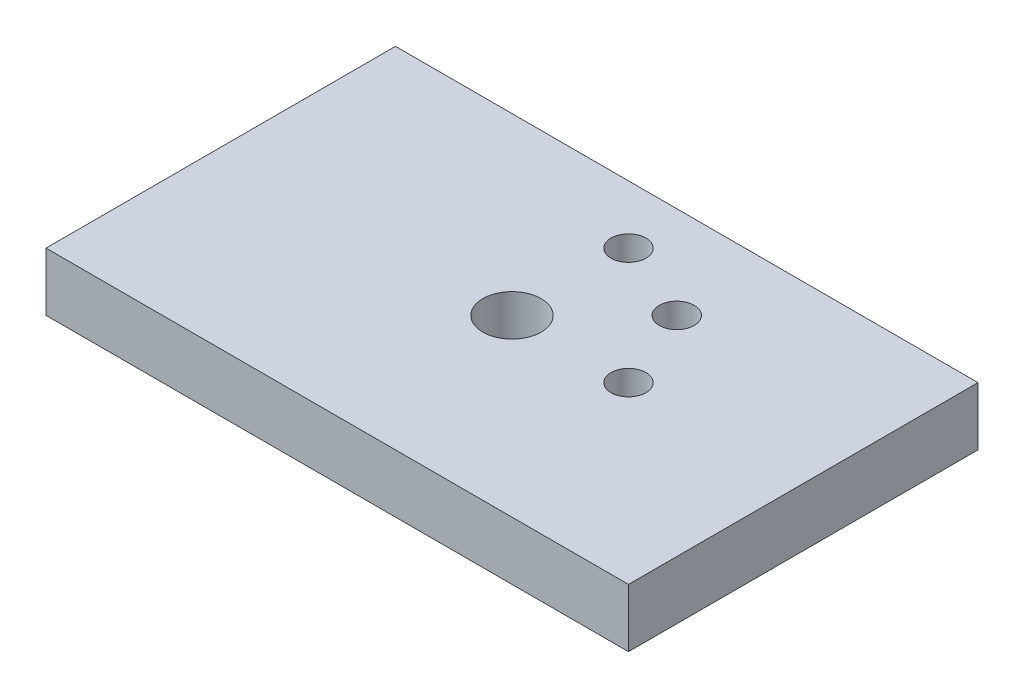
ISO-10303-21;
HEADER;
FILE_DESCRIPTION(('STEP AP214'),'2;1');
FILE_NAME('part.step','',(''),(''),'','','');
FILE_SCHEMA(('AUTOMOTIVE_DESIGN { 1 0 10303 214 1 1 1 1 }'));
ENDSEC;
DATA;
#1=APPLICATION_CONTEXT('core data for automotive mechanical design processes');
#2=APPLICATION_PROTOCOL_DEFINITION('international standard','automotive_design',2000,#1);
#3=PRODUCT_CONTEXT('',#1,'mechanical');
#4=PRODUCT('Part','Part','',(#3));
#5=PRODUCT_RELATED_PRODUCT_CATEGORY('part','',(#4));
#6=PRODUCT_DEFINITION_FORMATION('','',#4);
#7=PRODUCT_DEFINITION_CONTEXT('part definition',#1,'design');
#8=PRODUCT_DEFINITION('design','',#6,#7);
#9=PRODUCT_DEFINITION_SHAPE('','',#8);
#10=(LENGTH_UNIT() NAMED_UNIT(*) SI_UNIT(.MILLI.,.METRE.));
#11=(NAMED_UNIT(*) PLANE_ANGLE_UNIT() SI_UNIT($,.RADIAN.));
#12=(NAMED_UNIT(*) SI_UNIT($,.STERADIAN.) SOLID_ANGLE_UNIT());
#13=UNCERTAINTY_MEASURE_WITH_UNIT(LENGTH_MEASURE(1.E-05),#10,'distance_accuracy_value','');
#14=(GEOMETRIC_REPRESENTATION_CONTEXT(3) GLOBAL_UNCERTAINTY_ASSIGNED_CONTEXT((#13)) GLOBAL_UNIT_ASSIGNED_CONTEXT((#10,
#11,#12)) REPRESENTATION_CONTEXT('',''));
#15=CARTESIAN_POINT('',(0.,0.,0.));
#16=DIRECTION('',(0.,0.,1.));
#17=DIRECTION('',(1.,0.,0.));
#18=AXIS2_PLACEMENT_3D('',#15,#16,#17);
#19=CARTESIAN_POINT('',(50.,10.,30.));
#20=DIRECTION('',(-1.,0.,0.));
#21=DIRECTION('',(0.,0.,1.));
#22=AXIS2_PLACEMENT_3D('',#19,#20,#21);
#23=PLANE('',#22);
#24=DIRECTION('',(0.,0.,-1.));
#25=VECTOR('',#24,1.);
#26=CARTESIAN_POINT('',(50.,0.,30.));
#27=LINE('',#26,#25);
#28=CARTESIAN_POINT('',(50.,0.,30.));
#29=VERTEX_POINT('',#28);
#30=CARTESIAN_POINT('',(50.,0.,-30.));
#31=VERTEX_POINT('',#30);
#32=EDGE_CURVE('E102',#29,#31,#27,.T.);
#33=ORIENTED_EDGE('',*,*,#32,.T.);
#34=DIRECTION('',(0.,-1.,0.));
#35=VECTOR('',#34,1.);
#36=CARTESIAN_POINT('',(50.,10.,-30.));
#37=LINE('',#36,#35);
#38=CARTESIAN_POINT('',(50.,10.,-30.));
#39=VERTEX_POINT('',#38);
#40=EDGE_CURVE('E11',#39,#31,#37,.T.);
#41=ORIENTED_EDGE('',*,*,#40,.F.);
#42=DIRECTION('',(0.,0.,-1.));
#43=VECTOR('',#42,1.);
#44=CARTESIAN_POINT('',(50.,10.,30.));
#45=LINE('',#44,#43);
#46=CARTESIAN_POINT('',(50.,10.,30.));
#47=VERTEX_POINT('',#46);
#48=EDGE_CURVE('E90',#47,#39,#45,.T.);
#49=ORIENTED_EDGE('',*,*,#48,.F.);
#50=DIRECTION('',(0.,-1.,0.));
#51=VECTOR('',#50,1.);
#52=CARTESIAN_POINT('',(50.,10.,30.));
#53=LINE('',#52,#51);
#54=EDGE_CURVE('E98',#47,#29,#53,.T.);
#55=ORIENTED_EDGE('',*,*,#54,.T.);
#56=EDGE_LOOP('',(#33,#41,#49,#55));
#57=FACE_BOUND('',#56,.T.);
#58=ADVANCED_FACE('F39',(#57),#23,.F.);
#59=CARTESIAN_POINT('',(-50.,10.,-30.));
#60=DIRECTION('',(0.,0.,1.));
#61=DIRECTION('',(1.,0.,0.));
#62=AXIS2_PLACEMENT_3D('',#59,#60,#61);
#63=PLANE('',#62);
#64=DIRECTION('',(-1.,0.,0.));
#65=VECTOR('',#64,1.);
#66=CARTESIAN_POINT('',(-50.,0.,-30.));
#67=LINE('',#66,#65);
#68=CARTESIAN_POINT('',(-50.,0.,-30.));
#69=VERTEX_POINT('',#68);
#70=EDGE_CURVE('E94',#31,#69,#67,.T.);
#71=ORIENTED_EDGE('',*,*,#70,.T.);
#72=DIRECTION('',(0.,-1.,0.));
#73=VECTOR('',#72,1.);
#74=CARTESIAN_POINT('',(-50.,10.,-30.));
#75=LINE('',#74,#73);
#76=CARTESIAN_POINT('',(-50.,10.,-30.));
#77=VERTEX_POINT('',#76);
#78=EDGE_CURVE('E47',#77,#69,#75,.T.);
#79=ORIENTED_EDGE('',*,*,#78,.F.);
#80=DIRECTION('',(-1.,0.,0.));
#81=VECTOR('',#80,1.);
#82=CARTESIAN_POINT('',(-50.,10.,-30.));
#83=LINE('',#82,#81);
#84=EDGE_CURVE('E85',#39,#77,#83,.T.);
#85=ORIENTED_EDGE('',*,*,#84,.F.);
#86=ORIENTED_EDGE('',*,*,#40,.T.);
#87=EDGE_LOOP('',(#71,#79,#85,#86));
#88=FACE_BOUND('',#87,.T.);
#89=ADVANCED_FACE('F93',(#88),#63,.F.);
#90=CARTESIAN_POINT('',(-50.,10.,30.));
#91=DIRECTION('',(1.,0.,0.));
#92=DIRECTION('',(0.,0.,-1.));
#93=AXIS2_PLACEMENT_3D('',#90,#91,#92);
#94=PLANE('',#93);
#95=DIRECTION('',(0.,0.,1.));
#96=VECTOR('',#95,1.);
#97=CARTESIAN_POINT('',(-50.,0.,30.));
#98=LINE('',#97,#96);
#99=CARTESIAN_POINT('',(-50.,0.,30.));
#100=VERTEX_POINT('',#99);
#101=EDGE_CURVE('E72',#69,#100,#98,.T.);
#102=ORIENTED_EDGE('',*,*,#101,.T.);
#103=DIRECTION('',(0.,-1.,0.));
#104=VECTOR('',#103,1.);
#105=CARTESIAN_POINT('',(-50.,10.,30.));
#106=LINE('',#105,#104);
#107=CARTESIAN_POINT('',(-50.,10.,30.));
#108=VERTEX_POINT('',#107);
#109=EDGE_CURVE('E95',#108,#100,#106,.T.);
#110=ORIENTED_EDGE('',*,*,#109,.F.);
#111=DIRECTION('',(0.,0.,1.));
#112=VECTOR('',#111,1.);
#113=CARTESIAN_POINT('',(-50.,10.,30.));
#114=LINE('',#113,#112);
#115=EDGE_CURVE('E88',#77,#108,#114,.T.);
#116=ORIENTED_EDGE('',*,*,#115,.F.);
#117=ORIENTED_EDGE('',*,*,#78,.T.);
#118=EDGE_LOOP('',(#102,#110,#116,#117));
#119=FACE_BOUND('',#118,.T.);
#120=ADVANCED_FACE('F96',(#119),#94,.F.);
#121=CARTESIAN_POINT('',(-50.,10.,30.));
#122=DIRECTION('',(0.,0.,-1.));
#123=DIRECTION('',(-1.,0.,0.));
#124=AXIS2_PLACEMENT_3D('',#121,#122,#123);
#125=PLANE('',#124);
#126=DIRECTION('',(1.,0.,0.));
#127=VECTOR('',#126,1.);
#128=CARTESIAN_POINT('',(-50.,0.,30.));
#129=LINE('',#128,#127);
#130=EDGE_CURVE('E78',#100,#29,#129,.T.);
#131=ORIENTED_EDGE('',*,*,#130,.T.);
#132=ORIENTED_EDGE('',*,*,#54,.F.);
#133=DIRECTION('',(1.,0.,0.));
#134=VECTOR('',#133,1.);
#135=CARTESIAN_POINT('',(-50.,10.,30.));
#136=LINE('',#135,#134);
#137=EDGE_CURVE('E55',#108,#47,#136,.T.);
#138=ORIENTED_EDGE('',*,*,#137,.F.);
#139=ORIENTED_EDGE('',*,*,#109,.T.);
#140=EDGE_LOOP('',(#131,#132,#138,#139));
#141=FACE_BOUND('',#140,.T.);
#142=ADVANCED_FACE('F110',(#141),#125,.F.);
#143=CARTESIAN_POINT('',(0.,10.,0.));
#144=DIRECTION('',(0.,-1.,0.));
#145=DIRECTION('',(0.,0.,-1.));
#146=AXIS2_PLACEMENT_3D('',#143,#144,#145);
#147=PLANE('',#146);
#148=CARTESIAN_POINT('',(14.142135623731,10.,-14.142135623731));
#149=DIRECTION('',(0.,-1.,0.));
#150=DIRECTION('',(0.,0.,-1.));
#151=AXIS2_PLACEMENT_3D('',#148,#149,#150);
#152=CIRCLE('',#151,3.);
#153=CARTESIAN_POINT('',(14.142135623731,10.,-17.142135623731));
#154=VERTEX_POINT('',#153);
#155=EDGE_CURVE('E127',#154,#154,#152,.F.);
#156=ORIENTED_EDGE('',*,*,#155,.F.);
#157=EDGE_LOOP('',(#156));
#158=FACE_BOUND('',#157,.T.);
#159=CARTESIAN_POINT('',(0.,10.,-20.));
#160=DIRECTION('',(0.,-1.,0.));
#161=DIRECTION('',(0.,0.,-1.));
#162=AXIS2_PLACEMENT_3D('',#159,#160,#161);
#163=CIRCLE('',#162,3.);
#164=CARTESIAN_POINT('',(0.,10.,-23.));
#165=VERTEX_POINT('',#164);
#166=EDGE_CURVE('E130',#165,#165,#163,.F.);
#167=ORIENTED_EDGE('',*,*,#166,.F.);
#168=EDGE_LOOP('',(#167));
#169=FACE_BOUND('',#168,.T.);
#170=CARTESIAN_POINT('',(20.,10.,0.));
#171=DIRECTION('',(0.,-1.,0.));
#172=DIRECTION('',(0.,0.,-1.));
#173=AXIS2_PLACEMENT_3D('',#170,#171,#172);
#174=CIRCLE('',#173,3.);
#175=CARTESIAN_POINT('',(20.,10.,-3.));
#176=VERTEX_POINT('',#175);
#177=EDGE_CURVE('E121',#176,#176,#174,.F.);
#178=ORIENTED_EDGE('',*,*,#177,.F.);
#179=EDGE_LOOP('',(#178));
#180=FACE_BOUND('',#179,.T.);
#181=CARTESIAN_POINT('',(0.,10.,0.));
#182=DIRECTION('',(0.,-1.,0.));
#183=DIRECTION('',(0.,0.,-1.));
#184=AXIS2_PLACEMENT_3D('',#181,#182,#183);
#185=CIRCLE('',#184,5.);
#186=CARTESIAN_POINT('',(0.,10.,-5.));
#187=VERTEX_POINT('',#186);
#188=EDGE_CURVE('E105',#187,#187,#185,.F.);
#189=ORIENTED_EDGE('',*,*,#188,.F.);
#190=EDGE_LOOP('',(#189));
#191=FACE_BOUND('',#190,.T.);
#192=ORIENTED_EDGE('',*,*,#48,.T.);
#193=ORIENTED_EDGE('',*,*,#84,.T.);
#194=ORIENTED_EDGE('',*,*,#115,.T.);
#195=ORIENTED_EDGE('',*,*,#137,.T.);
#196=EDGE_LOOP('',(#192,#193,#194,#195));
#197=FACE_BOUND('',#196,.T.);
#198=ADVANCED_FACE('F86',(#158,#169,#180,#191,#197),#147,.F.);
#199=CARTESIAN_POINT('',(0.,0.,0.));
#200=DIRECTION('',(0.,-1.,0.));
#201=DIRECTION('',(0.,0.,-1.));
#202=AXIS2_PLACEMENT_3D('',#199,#200,#201);
#203=PLANE('',#202);
#204=CARTESIAN_POINT('',(14.142135623731,0.,-14.142135623731));
#205=DIRECTION('',(0.,1.,0.));
#206=DIRECTION('',(0.707106781186548,0.,0.707106781186548));
#207=AXIS2_PLACEMENT_3D('',#204,#205,#206);
#208=CIRCLE('',#207,3.);
#209=CARTESIAN_POINT('',(16.2634559672906,0.,-12.0208152801713));
#210=VERTEX_POINT('',#209);
#211=EDGE_CURVE('E133',#210,#210,#208,.T.);
#212=ORIENTED_EDGE('',*,*,#211,.T.);
#213=EDGE_LOOP('',(#212));
#214=FACE_BOUND('',#213,.T.);
#215=CARTESIAN_POINT('',(0.,0.,-20.));
#216=DIRECTION('',(0.,1.,0.));
#217=DIRECTION('',(1.,0.,0.));
#218=AXIS2_PLACEMENT_3D('',#215,#216,#217);
#219=CIRCLE('',#218,3.);
#220=CARTESIAN_POINT('',(3.,0.,-20.));
#221=VERTEX_POINT('',#220);
#222=EDGE_CURVE('E134',#221,#221,#219,.T.);
#223=ORIENTED_EDGE('',*,*,#222,.T.);
#224=EDGE_LOOP('',(#223));
#225=FACE_BOUND('',#224,.T.);
#226=CARTESIAN_POINT('',(20.,0.,0.));
#227=DIRECTION('',(0.,1.,0.));
#228=DIRECTION('',(0.,0.,1.));
#229=AXIS2_PLACEMENT_3D('',#226,#227,#228);
#230=CIRCLE('',#229,3.);
#231=CARTESIAN_POINT('',(20.,0.,3.));
#232=VERTEX_POINT('',#231);
#233=EDGE_CURVE('E124',#232,#232,#230,.T.);
#234=ORIENTED_EDGE('',*,*,#233,.T.);
#235=EDGE_LOOP('',(#234));
#236=FACE_BOUND('',#235,.T.);
#237=CARTESIAN_POINT('',(0.,0.,0.));
#238=DIRECTION('',(0.,1.,0.));
#239=DIRECTION('',(0.,0.,1.));
#240=AXIS2_PLACEMENT_3D('',#237,#238,#239);
#241=CIRCLE('',#240,5.);
#242=CARTESIAN_POINT('',(0.,0.,5.));
#243=VERTEX_POINT('',#242);
#244=EDGE_CURVE('E118',#243,#243,#241,.T.);
#245=ORIENTED_EDGE('',*,*,#244,.T.);
#246=EDGE_LOOP('',(#245));
#247=FACE_BOUND('',#246,.T.);
#248=ORIENTED_EDGE('',*,*,#32,.F.);
#249=ORIENTED_EDGE('',*,*,#130,.F.);
#250=ORIENTED_EDGE('',*,*,#101,.F.);
#251=ORIENTED_EDGE('',*,*,#70,.F.);
#252=EDGE_LOOP('',(#248,#249,#250,#251));
#253=FACE_BOUND('',#252,.T.);
#254=ADVANCED_FACE('F113',(#214,#225,#236,#247,#253),#203,.T.);
#255=CARTESIAN_POINT('',(0.,20.,0.));
#256=DIRECTION('',(0.,-1.,0.));
#257=DIRECTION('',(0.,0.,-1.));
#258=AXIS2_PLACEMENT_3D('',#255,#256,#257);
#259=CYLINDRICAL_SURFACE('',#258,5.);
#260=ORIENTED_EDGE('',*,*,#244,.F.);
#261=EDGE_LOOP('',(#260));
#262=FACE_BOUND('',#261,.T.);
#263=ORIENTED_EDGE('',*,*,#188,.T.);
#264=EDGE_LOOP('',(#263));
#265=FACE_BOUND('',#264,.T.);
#266=ADVANCED_FACE('F158',(#262,#265),#259,.F.);
#267=CARTESIAN_POINT('',(20.,20.,0.));
#268=DIRECTION('',(0.,-1.,0.));
#269=DIRECTION('',(0.,0.,-1.));
#270=AXIS2_PLACEMENT_3D('',#267,#268,#269);
#271=CYLINDRICAL_SURFACE('',#270,3.);
#272=ORIENTED_EDGE('',*,*,#233,.F.);
#273=EDGE_LOOP('',(#272));
#274=FACE_BOUND('',#273,.T.);
#275=ORIENTED_EDGE('',*,*,#177,.T.);
#276=EDGE_LOOP('',(#275));
#277=FACE_BOUND('',#276,.T.);
#278=ADVANCED_FACE('F160',(#274,#277),#271,.F.);
#279=CARTESIAN_POINT('',(0.,20.,-20.));
#280=DIRECTION('',(0.,-1.,0.));
#281=DIRECTION('',(0.,0.,-1.));
#282=AXIS2_PLACEMENT_3D('',#279,#280,#281);
#283=CYLINDRICAL_SURFACE('',#282,3.);
#284=ORIENTED_EDGE('',*,*,#222,.F.);
#285=EDGE_LOOP('',(#284));
#286=FACE_BOUND('',#285,.T.);
#287=ORIENTED_EDGE('',*,*,#166,.T.);
#288=EDGE_LOOP('',(#287));
#289=FACE_BOUND('',#288,.T.);
#290=ADVANCED_FACE('F145',(#286,#289),#283,.F.);
#291=CARTESIAN_POINT('',(14.142135623731,20.,-14.142135623731));
#292=DIRECTION('',(0.,-1.,0.));
#293=DIRECTION('',(0.,0.,-1.));
#294=AXIS2_PLACEMENT_3D('',#291,#292,#293);
#295=CYLINDRICAL_SURFACE('',#294,3.);
#296=ORIENTED_EDGE('',*,*,#211,.F.);
#297=EDGE_LOOP('',(#296));
#298=FACE_BOUND('',#297,.T.);
#299=ORIENTED_EDGE('',*,*,#155,.T.);
#300=EDGE_LOOP('',(#299));
#301=FACE_BOUND('',#300,.T.);
#302=ADVANCED_FACE('F142',(#298,#301),#295,.F.);
#303=CLOSED_SHELL('',(#58,#89,#120,#142,#198,#254,#266,#278,#290,#302));
#304=MANIFOLD_SOLID_BREP('B2',#303);
#305=ADVANCED_BREP_SHAPE_REPRESENTATION('',(#18,#304),#14);
#306=SHAPE_DEFINITION_REPRESENTATION(#9,#305);
ENDSEC;
END-ISO-10303-21;
